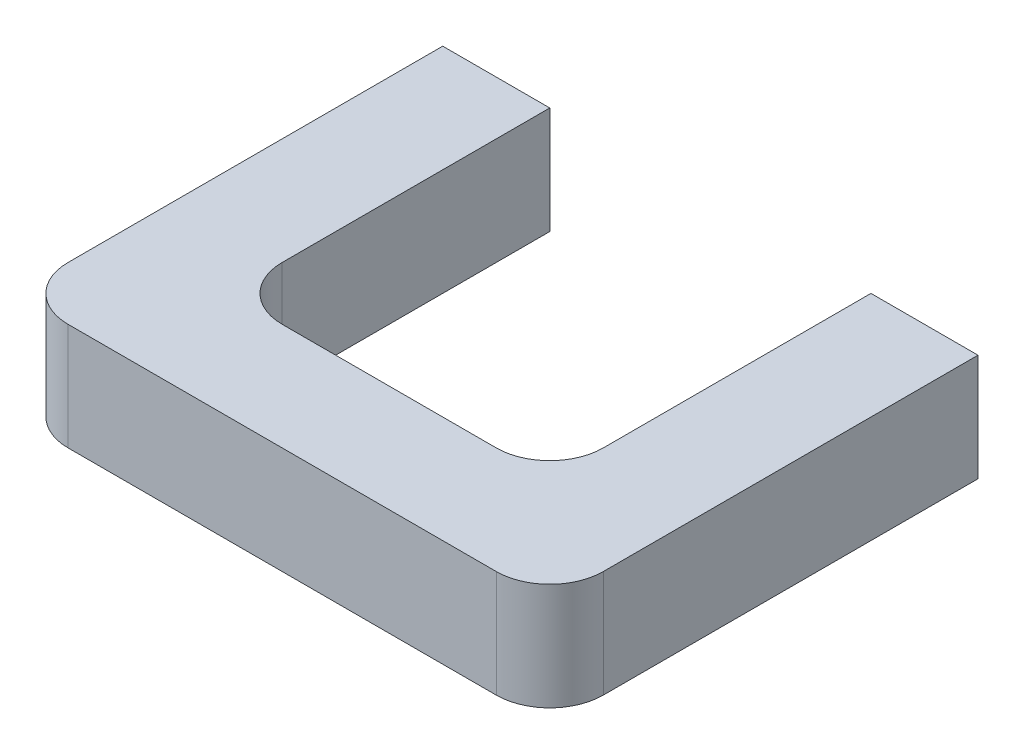
ISO-10303-21;
HEADER;
FILE_DESCRIPTION(('STEP AP214'),'2;1');
FILE_NAME('part.step','',(''),(''),'','','');
FILE_SCHEMA(('AUTOMOTIVE_DESIGN { 1 0 10303 214 1 1 1 1 }'));
ENDSEC;
DATA;
#1=APPLICATION_CONTEXT('core data for automotive mechanical design processes');
#2=APPLICATION_PROTOCOL_DEFINITION('international standard','automotive_design',2000,#1);
#3=PRODUCT_CONTEXT('',#1,'mechanical');
#4=PRODUCT('Part','Part','',(#3));
#5=PRODUCT_RELATED_PRODUCT_CATEGORY('part','',(#4));
#6=PRODUCT_DEFINITION_FORMATION('','',#4);
#7=PRODUCT_DEFINITION_CONTEXT('part definition',#1,'design');
#8=PRODUCT_DEFINITION('design','',#6,#7);
#9=PRODUCT_DEFINITION_SHAPE('','',#8);
#10=(LENGTH_UNIT() NAMED_UNIT(*) SI_UNIT(.MILLI.,.METRE.));
#11=(NAMED_UNIT(*) PLANE_ANGLE_UNIT() SI_UNIT($,.RADIAN.));
#12=(NAMED_UNIT(*) SI_UNIT($,.STERADIAN.) SOLID_ANGLE_UNIT());
#13=UNCERTAINTY_MEASURE_WITH_UNIT(LENGTH_MEASURE(1.E-05),#10,'distance_accuracy_value','');
#14=(GEOMETRIC_REPRESENTATION_CONTEXT(3) GLOBAL_UNCERTAINTY_ASSIGNED_CONTEXT((#13)) GLOBAL_UNIT_ASSIGNED_CONTEXT((#10,
#11,#12)) REPRESENTATION_CONTEXT('',''));
#15=CARTESIAN_POINT('',(0.,0.,0.));
#16=DIRECTION('',(0.,0.,1.));
#17=DIRECTION('',(1.,0.,0.));
#18=AXIS2_PLACEMENT_3D('',#15,#16,#17);
#19=CARTESIAN_POINT('',(7.03889779933033,25.4,-138.158284391907));
#20=DIRECTION('',(0.,0.,1.));
#21=DIRECTION('',(1.,0.,0.));
#22=AXIS2_PLACEMENT_3D('',#19,#20,#21);
#23=PLANE('',#22);
#24=DIRECTION('',(-1.,0.,0.));
#25=VECTOR('',#24,1.);
#26=CARTESIAN_POINT('',(7.03889779933033,0.,-138.158284391907));
#27=LINE('',#26,#25);
#28=CARTESIAN_POINT('',(7.03889779933033,0.,-138.158284391907));
#29=VERTEX_POINT('',#28);
#30=CARTESIAN_POINT('',(-18.3611022006697,0.,-138.158284391907));
#31=VERTEX_POINT('',#30);
#32=EDGE_CURVE('E139',#29,#31,#27,.T.);
#33=ORIENTED_EDGE('',*,*,#32,.T.);
#34=DIRECTION('',(0.,-1.,0.));
#35=VECTOR('',#34,1.);
#36=CARTESIAN_POINT('',(-18.3611022006697,25.4,-138.158284391907));
#37=LINE('',#36,#35);
#38=CARTESIAN_POINT('',(-18.3611022006697,25.4,-138.158284391907));
#39=VERTEX_POINT('',#38);
#40=EDGE_CURVE('E122',#39,#31,#37,.T.);
#41=ORIENTED_EDGE('',*,*,#40,.F.);
#42=DIRECTION('',(-1.,0.,0.));
#43=VECTOR('',#42,1.);
#44=CARTESIAN_POINT('',(7.03889779933033,25.4,-138.158284391907));
#45=LINE('',#44,#43);
#46=CARTESIAN_POINT('',(7.03889779933033,25.4,-138.158284391907));
#47=VERTEX_POINT('',#46);
#48=EDGE_CURVE('E127',#47,#39,#45,.T.);
#49=ORIENTED_EDGE('',*,*,#48,.F.);
#50=DIRECTION('',(0.,-1.,0.));
#51=VECTOR('',#50,1.);
#52=CARTESIAN_POINT('',(7.03889779933033,25.4,-138.158284391907));
#53=LINE('',#52,#51);
#54=EDGE_CURVE('E204',#47,#29,#53,.T.);
#55=ORIENTED_EDGE('',*,*,#54,.T.);
#56=EDGE_LOOP('',(#33,#41,#49,#55));
#57=FACE_BOUND('',#56,.T.);
#58=ADVANCED_FACE('F33',(#57),#23,.F.);
#59=CARTESIAN_POINT('',(-18.3611022006697,25.4,-138.158284391907));
#60=DIRECTION('',(1.,0.,0.));
#61=DIRECTION('',(0.,0.,-1.));
#62=AXIS2_PLACEMENT_3D('',#59,#60,#61);
#63=PLANE('',#62);
#64=DIRECTION('',(0.,0.,1.));
#65=VECTOR('',#64,1.);
#66=CARTESIAN_POINT('',(-18.3611022006697,0.,-138.158284391907));
#67=LINE('',#66,#65);
#68=CARTESIAN_POINT('',(-18.3611022006697,0.,-49.2582843919074));
#69=VERTEX_POINT('',#68);
#70=EDGE_CURVE('E189',#31,#69,#67,.T.);
#71=ORIENTED_EDGE('',*,*,#70,.T.);
#72=DIRECTION('',(0.,-1.,0.));
#73=VECTOR('',#72,1.);
#74=CARTESIAN_POINT('',(-18.3611022006697,25.4,-49.2582843919074));
#75=LINE('',#74,#73);
#76=CARTESIAN_POINT('',(-18.3611022006697,25.4,-49.2582843919074));
#77=VERTEX_POINT('',#76);
#78=EDGE_CURVE('E41',#69,#77,#75,.F.);
#79=ORIENTED_EDGE('',*,*,#78,.T.);
#80=DIRECTION('',(0.,0.,1.));
#81=VECTOR('',#80,1.);
#82=CARTESIAN_POINT('',(-18.3611022006697,25.4,-138.158284391907));
#83=LINE('',#82,#81);
#84=EDGE_CURVE('E118',#39,#77,#83,.T.);
#85=ORIENTED_EDGE('',*,*,#84,.F.);
#86=ORIENTED_EDGE('',*,*,#40,.T.);
#87=EDGE_LOOP('',(#71,#79,#85,#86));
#88=FACE_BOUND('',#87,.T.);
#89=ADVANCED_FACE('F120',(#88),#63,.F.);
#90=CARTESIAN_POINT('',(-18.3611022006697,25.4,-36.5582843919074));
#91=DIRECTION('',(0.,0.,-1.));
#92=DIRECTION('',(-1.,0.,0.));
#93=AXIS2_PLACEMENT_3D('',#90,#91,#92);
#94=PLANE('',#93);
#95=DIRECTION('',(1.,0.,0.));
#96=VECTOR('',#95,1.);
#97=CARTESIAN_POINT('',(-18.3611022006697,25.4,-36.5582843919074));
#98=LINE('',#97,#96);
#99=CARTESIAN_POINT('',(-5.66110220066968,25.4,-36.5582843919074));
#100=VERTEX_POINT('',#99);
#101=CARTESIAN_POINT('',(95.9388977993303,25.4,-36.5582843919074));
#102=VERTEX_POINT('',#101);
#103=EDGE_CURVE('E126',#100,#102,#98,.T.);
#104=ORIENTED_EDGE('',*,*,#103,.F.);
#105=DIRECTION('',(0.,-1.,0.));
#106=VECTOR('',#105,1.);
#107=CARTESIAN_POINT('',(-5.66110220066968,25.4,-36.5582843919074));
#108=LINE('',#107,#106);
#109=CARTESIAN_POINT('',(-5.66110220066968,0.,-36.5582843919074));
#110=VERTEX_POINT('',#109);
#111=EDGE_CURVE('E176',#100,#110,#108,.T.);
#112=ORIENTED_EDGE('',*,*,#111,.T.);
#113=DIRECTION('',(1.,0.,0.));
#114=VECTOR('',#113,1.);
#115=CARTESIAN_POINT('',(-18.3611022006697,0.,-36.5582843919074));
#116=LINE('',#115,#114);
#117=CARTESIAN_POINT('',(95.9388977993303,0.,-36.5582843919074));
#118=VERTEX_POINT('',#117);
#119=EDGE_CURVE('E183',#110,#118,#116,.T.);
#120=ORIENTED_EDGE('',*,*,#119,.T.);
#121=DIRECTION('',(0.,-1.,0.));
#122=VECTOR('',#121,1.);
#123=CARTESIAN_POINT('',(95.9388977993303,25.4,-36.5582843919074));
#124=LINE('',#123,#122);
#125=EDGE_CURVE('E171',#118,#102,#124,.F.);
#126=ORIENTED_EDGE('',*,*,#125,.T.);
#127=EDGE_LOOP('',(#104,#112,#120,#126));
#128=FACE_BOUND('',#127,.T.);
#129=ADVANCED_FACE('F182',(#128),#94,.F.);
#130=CARTESIAN_POINT('',(108.63889779933,25.4,-36.5582843919074));
#131=DIRECTION('',(-1.,0.,0.));
#132=DIRECTION('',(0.,0.,1.));
#133=AXIS2_PLACEMENT_3D('',#130,#131,#132);
#134=PLANE('',#133);
#135=DIRECTION('',(0.,0.,-1.));
#136=VECTOR('',#135,1.);
#137=CARTESIAN_POINT('',(108.63889779933,25.4,-36.5582843919074));
#138=LINE('',#137,#136);
#139=CARTESIAN_POINT('',(108.63889779933,25.4,-49.2582843919074));
#140=VERTEX_POINT('',#139);
#141=CARTESIAN_POINT('',(108.63889779933,25.4,-138.158284391907));
#142=VERTEX_POINT('',#141);
#143=EDGE_CURVE('E235',#140,#142,#138,.T.);
#144=ORIENTED_EDGE('',*,*,#143,.F.);
#145=DIRECTION('',(0.,-1.,0.));
#146=VECTOR('',#145,1.);
#147=CARTESIAN_POINT('',(108.63889779933,25.4,-49.2582843919074));
#148=LINE('',#147,#146);
#149=CARTESIAN_POINT('',(108.63889779933,0.,-49.2582843919074));
#150=VERTEX_POINT('',#149);
#151=EDGE_CURVE('E165',#140,#150,#148,.T.);
#152=ORIENTED_EDGE('',*,*,#151,.T.);
#153=DIRECTION('',(0.,0.,-1.));
#154=VECTOR('',#153,1.);
#155=CARTESIAN_POINT('',(108.63889779933,0.,-36.5582843919074));
#156=LINE('',#155,#154);
#157=CARTESIAN_POINT('',(108.63889779933,0.,-138.158284391907));
#158=VERTEX_POINT('',#157);
#159=EDGE_CURVE('E188',#150,#158,#156,.T.);
#160=ORIENTED_EDGE('',*,*,#159,.T.);
#161=DIRECTION('',(0.,-1.,0.));
#162=VECTOR('',#161,1.);
#163=CARTESIAN_POINT('',(108.63889779933,25.4,-138.158284391907));
#164=LINE('',#163,#162);
#165=EDGE_CURVE('E141',#142,#158,#164,.T.);
#166=ORIENTED_EDGE('',*,*,#165,.F.);
#167=EDGE_LOOP('',(#144,#152,#160,#166));
#168=FACE_BOUND('',#167,.T.);
#169=ADVANCED_FACE('F243',(#168),#134,.F.);
#170=CARTESIAN_POINT('',(108.63889779933,25.4,-138.158284391907));
#171=DIRECTION('',(0.,0.,1.));
#172=DIRECTION('',(1.,0.,0.));
#173=AXIS2_PLACEMENT_3D('',#170,#171,#172);
#174=PLANE('',#173);
#175=DIRECTION('',(-1.,0.,0.));
#176=VECTOR('',#175,1.);
#177=CARTESIAN_POINT('',(108.63889779933,0.,-138.158284391907));
#178=LINE('',#177,#176);
#179=CARTESIAN_POINT('',(83.2388977993303,0.,-138.158284391907));
#180=VERTEX_POINT('',#179);
#181=EDGE_CURVE('E191',#158,#180,#178,.T.);
#182=ORIENTED_EDGE('',*,*,#181,.T.);
#183=DIRECTION('',(0.,-1.,0.));
#184=VECTOR('',#183,1.);
#185=CARTESIAN_POINT('',(83.2388977993303,25.4,-138.158284391907));
#186=LINE('',#185,#184);
#187=CARTESIAN_POINT('',(83.2388977993303,25.4,-138.158284391907));
#188=VERTEX_POINT('',#187);
#189=EDGE_CURVE('E147',#188,#180,#186,.T.);
#190=ORIENTED_EDGE('',*,*,#189,.F.);
#191=DIRECTION('',(-1.,0.,0.));
#192=VECTOR('',#191,1.);
#193=CARTESIAN_POINT('',(108.63889779933,25.4,-138.158284391907));
#194=LINE('',#193,#192);
#195=EDGE_CURVE('E231',#142,#188,#194,.T.);
#196=ORIENTED_EDGE('',*,*,#195,.F.);
#197=ORIENTED_EDGE('',*,*,#165,.T.);
#198=EDGE_LOOP('',(#182,#190,#196,#197));
#199=FACE_BOUND('',#198,.T.);
#200=ADVANCED_FACE('F245',(#199),#174,.F.);
#201=CARTESIAN_POINT('',(83.2388977993303,25.4,-138.158284391907));
#202=DIRECTION('',(1.,0.,0.));
#203=DIRECTION('',(0.,0.,-1.));
#204=AXIS2_PLACEMENT_3D('',#201,#202,#203);
#205=PLANE('',#204);
#206=DIRECTION('',(0.,0.,1.));
#207=VECTOR('',#206,1.);
#208=CARTESIAN_POINT('',(83.2388977993303,0.,-138.158284391907));
#209=LINE('',#208,#207);
#210=CARTESIAN_POINT('',(83.2388977993303,0.,-74.6582843919074));
#211=VERTEX_POINT('',#210);
#212=EDGE_CURVE('E197',#180,#211,#209,.T.);
#213=ORIENTED_EDGE('',*,*,#212,.T.);
#214=DIRECTION('',(0.,-1.,0.));
#215=VECTOR('',#214,1.);
#216=CARTESIAN_POINT('',(83.2388977993303,25.4,-74.6582843919074));
#217=LINE('',#216,#215);
#218=CARTESIAN_POINT('',(83.2388977993303,25.4,-74.6582843919074));
#219=VERTEX_POINT('',#218);
#220=EDGE_CURVE('E144',#211,#219,#217,.F.);
#221=ORIENTED_EDGE('',*,*,#220,.T.);
#222=DIRECTION('',(0.,0.,1.));
#223=VECTOR('',#222,1.);
#224=CARTESIAN_POINT('',(83.2388977993303,25.4,-138.158284391907));
#225=LINE('',#224,#223);
#226=EDGE_CURVE('E213',#188,#219,#225,.T.);
#227=ORIENTED_EDGE('',*,*,#226,.F.);
#228=ORIENTED_EDGE('',*,*,#189,.T.);
#229=EDGE_LOOP('',(#213,#221,#227,#228));
#230=FACE_BOUND('',#229,.T.);
#231=ADVANCED_FACE('F210',(#230),#205,.F.);
#232=CARTESIAN_POINT('',(83.2388977993303,25.4,-61.9582843919074));
#233=DIRECTION('',(0.,0.,1.));
#234=DIRECTION('',(1.,0.,0.));
#235=AXIS2_PLACEMENT_3D('',#232,#233,#234);
#236=PLANE('',#235);
#237=DIRECTION('',(-1.,0.,0.));
#238=VECTOR('',#237,1.);
#239=CARTESIAN_POINT('',(83.2388977993303,0.,-61.9582843919074));
#240=LINE('',#239,#238);
#241=CARTESIAN_POINT('',(70.5388977993303,0.,-61.9582843919074));
#242=VERTEX_POINT('',#241);
#243=CARTESIAN_POINT('',(19.7388977993304,0.,-61.9582843919073));
#244=VERTEX_POINT('',#243);
#245=EDGE_CURVE('E200',#242,#244,#240,.T.);
#246=ORIENTED_EDGE('',*,*,#245,.T.);
#247=DIRECTION('',(0.,-1.,0.));
#248=VECTOR('',#247,1.);
#249=CARTESIAN_POINT('',(19.7388977993303,25.4,-61.9582843919073));
#250=LINE('',#249,#248);
#251=CARTESIAN_POINT('',(19.7388977993304,25.4,-61.9582843919073));
#252=VERTEX_POINT('',#251);
#253=EDGE_CURVE('E159',#244,#252,#250,.F.);
#254=ORIENTED_EDGE('',*,*,#253,.T.);
#255=DIRECTION('',(-1.,0.,0.));
#256=VECTOR('',#255,1.);
#257=CARTESIAN_POINT('',(83.2388977993303,25.4,-61.9582843919074));
#258=LINE('',#257,#256);
#259=CARTESIAN_POINT('',(70.5388977993303,25.4,-61.9582843919074));
#260=VERTEX_POINT('',#259);
#261=EDGE_CURVE('E227',#260,#252,#258,.T.);
#262=ORIENTED_EDGE('',*,*,#261,.F.);
#263=DIRECTION('',(0.,-1.,0.));
#264=VECTOR('',#263,1.);
#265=CARTESIAN_POINT('',(70.5388977993303,0.,-61.9582843919074));
#266=LINE('',#265,#264);
#267=EDGE_CURVE('E140',#260,#242,#266,.T.);
#268=ORIENTED_EDGE('',*,*,#267,.T.);
#269=EDGE_LOOP('',(#246,#254,#262,#268));
#270=FACE_BOUND('',#269,.T.);
#271=ADVANCED_FACE('F224',(#270),#236,.F.);
#272=CARTESIAN_POINT('',(7.03889779933034,25.4,-61.9582843919073));
#273=DIRECTION('',(-1.,0.,0.));
#274=DIRECTION('',(0.,0.,1.));
#275=AXIS2_PLACEMENT_3D('',#272,#273,#274);
#276=PLANE('',#275);
#277=DIRECTION('',(0.,0.,-1.));
#278=VECTOR('',#277,1.);
#279=CARTESIAN_POINT('',(7.03889779933034,25.4,-61.9582843919073));
#280=LINE('',#279,#278);
#281=CARTESIAN_POINT('',(7.03889779933034,25.4,-74.6582843919073));
#282=VERTEX_POINT('',#281);
#283=EDGE_CURVE('E132',#282,#47,#280,.T.);
#284=ORIENTED_EDGE('',*,*,#283,.F.);
#285=DIRECTION('',(0.,-1.,0.));
#286=VECTOR('',#285,1.);
#287=CARTESIAN_POINT('',(7.03889779933034,0.,-74.6582843919073));
#288=LINE('',#287,#286);
#289=CARTESIAN_POINT('',(7.03889779933034,0.,-74.6582843919073));
#290=VERTEX_POINT('',#289);
#291=EDGE_CURVE('E156',#282,#290,#288,.T.);
#292=ORIENTED_EDGE('',*,*,#291,.T.);
#293=DIRECTION('',(0.,0.,-1.));
#294=VECTOR('',#293,1.);
#295=CARTESIAN_POINT('',(7.03889779933034,0.,-61.9582843919073));
#296=LINE('',#295,#294);
#297=EDGE_CURVE('E136',#290,#29,#296,.T.);
#298=ORIENTED_EDGE('',*,*,#297,.T.);
#299=ORIENTED_EDGE('',*,*,#54,.F.);
#300=EDGE_LOOP('',(#284,#292,#298,#299));
#301=FACE_BOUND('',#300,.T.);
#302=ADVANCED_FACE('F292',(#301),#276,.F.);
#303=CARTESIAN_POINT('',(0.,25.4,0.));
#304=DIRECTION('',(0.,1.,0.));
#305=DIRECTION('',(0.,0.,1.));
#306=AXIS2_PLACEMENT_3D('',#303,#304,#305);
#307=PLANE('',#306);
#308=ORIENTED_EDGE('',*,*,#84,.T.);
#309=CARTESIAN_POINT('',(-5.66110220066968,25.4,-49.2582843919074));
#310=DIRECTION('',(0.,1.,0.));
#311=DIRECTION('',(0.,0.,1.));
#312=AXIS2_PLACEMENT_3D('',#309,#310,#311);
#313=CIRCLE('',#312,12.7);
#314=EDGE_CURVE('E11',#77,#100,#313,.T.);
#315=ORIENTED_EDGE('',*,*,#314,.T.);
#316=ORIENTED_EDGE('',*,*,#103,.T.);
#317=CARTESIAN_POINT('',(95.9388977993303,25.4,-49.2582843919074));
#318=DIRECTION('',(0.,1.,0.));
#319=DIRECTION('',(0.,0.,1.));
#320=AXIS2_PLACEMENT_3D('',#317,#318,#319);
#321=CIRCLE('',#320,12.7);
#322=EDGE_CURVE('E174',#102,#140,#321,.T.);
#323=ORIENTED_EDGE('',*,*,#322,.T.);
#324=ORIENTED_EDGE('',*,*,#143,.T.);
#325=ORIENTED_EDGE('',*,*,#195,.T.);
#326=ORIENTED_EDGE('',*,*,#226,.T.);
#327=CARTESIAN_POINT('',(70.5388977993303,25.4,-74.6582843919074));
#328=DIRECTION('',(0.,1.,0.));
#329=DIRECTION('',(0.,0.,1.));
#330=AXIS2_PLACEMENT_3D('',#327,#328,#329);
#331=CIRCLE('',#330,12.7);
#332=EDGE_CURVE('E154',#219,#260,#331,.F.);
#333=ORIENTED_EDGE('',*,*,#332,.T.);
#334=ORIENTED_EDGE('',*,*,#261,.T.);
#335=CARTESIAN_POINT('',(19.7388977993303,25.4,-74.6582843919073));
#336=DIRECTION('',(0.,1.,0.));
#337=DIRECTION('',(0.,0.,1.));
#338=AXIS2_PLACEMENT_3D('',#335,#336,#337);
#339=CIRCLE('',#338,12.7);
#340=EDGE_CURVE('E163',#252,#282,#339,.F.);
#341=ORIENTED_EDGE('',*,*,#340,.T.);
#342=ORIENTED_EDGE('',*,*,#283,.T.);
#343=ORIENTED_EDGE('',*,*,#48,.T.);
#344=EDGE_LOOP('',(#308,#315,#316,#323,#324,#325,#326,#333,#334,#341,#342,#343));
#345=FACE_BOUND('',#344,.T.);
#346=ADVANCED_FACE('F130',(#345),#307,.T.);
#347=CARTESIAN_POINT('',(0.,0.,0.));
#348=DIRECTION('',(0.,1.,0.));
#349=DIRECTION('',(0.,0.,1.));
#350=AXIS2_PLACEMENT_3D('',#347,#348,#349);
#351=PLANE('',#350);
#352=ORIENTED_EDGE('',*,*,#119,.F.);
#353=CARTESIAN_POINT('',(-5.66110220066968,0.,-49.2582843919074));
#354=DIRECTION('',(0.,1.,0.));
#355=DIRECTION('',(0.,0.,1.));
#356=AXIS2_PLACEMENT_3D('',#353,#354,#355);
#357=CIRCLE('',#356,12.7);
#358=EDGE_CURVE('E55',#110,#69,#357,.F.);
#359=ORIENTED_EDGE('',*,*,#358,.T.);
#360=ORIENTED_EDGE('',*,*,#70,.F.);
#361=ORIENTED_EDGE('',*,*,#32,.F.);
#362=ORIENTED_EDGE('',*,*,#297,.F.);
#363=CARTESIAN_POINT('',(19.7388977993303,0.,-74.6582843919073));
#364=DIRECTION('',(0.,1.,0.));
#365=DIRECTION('',(0.,0.,1.));
#366=AXIS2_PLACEMENT_3D('',#363,#364,#365);
#367=CIRCLE('',#366,12.7);
#368=EDGE_CURVE('E161',#290,#244,#367,.T.);
#369=ORIENTED_EDGE('',*,*,#368,.T.);
#370=ORIENTED_EDGE('',*,*,#245,.F.);
#371=CARTESIAN_POINT('',(70.5388977993303,0.,-74.6582843919074));
#372=DIRECTION('',(0.,1.,0.));
#373=DIRECTION('',(0.,0.,1.));
#374=AXIS2_PLACEMENT_3D('',#371,#372,#373);
#375=CIRCLE('',#374,12.7);
#376=EDGE_CURVE('E152',#242,#211,#375,.T.);
#377=ORIENTED_EDGE('',*,*,#376,.T.);
#378=ORIENTED_EDGE('',*,*,#212,.F.);
#379=ORIENTED_EDGE('',*,*,#181,.F.);
#380=ORIENTED_EDGE('',*,*,#159,.F.);
#381=CARTESIAN_POINT('',(95.9388977993303,0.,-49.2582843919074));
#382=DIRECTION('',(0.,1.,0.));
#383=DIRECTION('',(0.,0.,1.));
#384=AXIS2_PLACEMENT_3D('',#381,#382,#383);
#385=CIRCLE('',#384,12.7);
#386=EDGE_CURVE('E168',#150,#118,#385,.F.);
#387=ORIENTED_EDGE('',*,*,#386,.T.);
#388=EDGE_LOOP('',(#352,#359,#360,#361,#362,#369,#370,#377,#378,#379,#380,#387));
#389=FACE_BOUND('',#388,.T.);
#390=ADVANCED_FACE('F185',(#389),#351,.F.);
#391=CARTESIAN_POINT('',(70.5388977993303,25.4,-74.6582843919074));
#392=DIRECTION('',(0.,1.,0.));
#393=DIRECTION('',(0.,0.,1.));
#394=AXIS2_PLACEMENT_3D('',#391,#392,#393);
#395=CYLINDRICAL_SURFACE('',#394,12.7);
#396=ORIENTED_EDGE('',*,*,#332,.F.);
#397=ORIENTED_EDGE('',*,*,#220,.F.);
#398=ORIENTED_EDGE('',*,*,#376,.F.);
#399=ORIENTED_EDGE('',*,*,#267,.F.);
#400=EDGE_LOOP('',(#396,#397,#398,#399));
#401=FACE_BOUND('',#400,.T.);
#402=ADVANCED_FACE('F221',(#401),#395,.F.);
#403=CARTESIAN_POINT('',(19.7388977993303,25.4,-74.6582843919073));
#404=DIRECTION('',(0.,1.,0.));
#405=DIRECTION('',(0.,0.,1.));
#406=AXIS2_PLACEMENT_3D('',#403,#404,#405);
#407=CYLINDRICAL_SURFACE('',#406,12.7);
#408=ORIENTED_EDGE('',*,*,#340,.F.);
#409=ORIENTED_EDGE('',*,*,#253,.F.);
#410=ORIENTED_EDGE('',*,*,#368,.F.);
#411=ORIENTED_EDGE('',*,*,#291,.F.);
#412=EDGE_LOOP('',(#408,#409,#410,#411));
#413=FACE_BOUND('',#412,.T.);
#414=ADVANCED_FACE('F264',(#413),#407,.F.);
#415=CARTESIAN_POINT('',(95.9388977993303,25.4,-49.2582843919074));
#416=DIRECTION('',(0.,-1.,0.));
#417=DIRECTION('',(0.,0.,-1.));
#418=AXIS2_PLACEMENT_3D('',#415,#416,#417);
#419=CYLINDRICAL_SURFACE('',#418,12.7);
#420=ORIENTED_EDGE('',*,*,#322,.F.);
#421=ORIENTED_EDGE('',*,*,#125,.F.);
#422=ORIENTED_EDGE('',*,*,#386,.F.);
#423=ORIENTED_EDGE('',*,*,#151,.F.);
#424=EDGE_LOOP('',(#420,#421,#422,#423));
#425=FACE_BOUND('',#424,.T.);
#426=ADVANCED_FACE('F241',(#425),#419,.T.);
#427=CARTESIAN_POINT('',(-5.66110220066968,25.4,-49.2582843919074));
#428=DIRECTION('',(0.,-1.,0.));
#429=DIRECTION('',(0.,0.,-1.));
#430=AXIS2_PLACEMENT_3D('',#427,#428,#429);
#431=CYLINDRICAL_SURFACE('',#430,12.7);
#432=ORIENTED_EDGE('',*,*,#314,.F.);
#433=ORIENTED_EDGE('',*,*,#78,.F.);
#434=ORIENTED_EDGE('',*,*,#358,.F.);
#435=ORIENTED_EDGE('',*,*,#111,.F.);
#436=EDGE_LOOP('',(#432,#433,#434,#435));
#437=FACE_BOUND('',#436,.T.);
#438=ADVANCED_FACE('F35',(#437),#431,.T.);
#439=CLOSED_SHELL('',(#58,#89,#129,#169,#200,#231,#271,#302,#346,#390,#402,#414,#426,#438));
#440=MANIFOLD_SOLID_BREP('B2',#439);
#441=ADVANCED_BREP_SHAPE_REPRESENTATION('',(#18,#440),#14);
#442=SHAPE_DEFINITION_REPRESENTATION(#9,#441);
ENDSEC;
END-ISO-10303-21;
